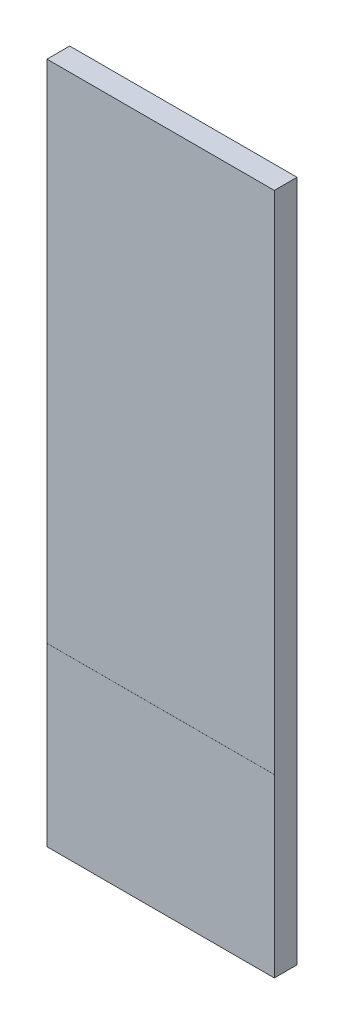
ISO-10303-21;
HEADER;
FILE_DESCRIPTION(('STEP AP214'),'2;1');
FILE_NAME('part.step','',(''),(''),'','','');
FILE_SCHEMA(('AUTOMOTIVE_DESIGN { 1 0 10303 214 1 1 1 1 }'));
ENDSEC;
DATA;
#1=APPLICATION_CONTEXT('core data for automotive mechanical design processes');
#2=APPLICATION_PROTOCOL_DEFINITION('international standard','automotive_design',2000,#1);
#3=PRODUCT_CONTEXT('',#1,'mechanical');
#4=PRODUCT('Part','Part','',(#3));
#5=PRODUCT_RELATED_PRODUCT_CATEGORY('part','',(#4));
#6=PRODUCT_DEFINITION_FORMATION('','',#4);
#7=PRODUCT_DEFINITION_CONTEXT('part definition',#1,'design');
#8=PRODUCT_DEFINITION('design','',#6,#7);
#9=PRODUCT_DEFINITION_SHAPE('','',#8);
#10=(LENGTH_UNIT() NAMED_UNIT(*) SI_UNIT(.MILLI.,.METRE.));
#11=(NAMED_UNIT(*) PLANE_ANGLE_UNIT() SI_UNIT($,.RADIAN.));
#12=(NAMED_UNIT(*) SI_UNIT($,.STERADIAN.) SOLID_ANGLE_UNIT());
#13=UNCERTAINTY_MEASURE_WITH_UNIT(LENGTH_MEASURE(1.E-05),#10,'distance_accuracy_value','');
#14=(GEOMETRIC_REPRESENTATION_CONTEXT(3) GLOBAL_UNCERTAINTY_ASSIGNED_CONTEXT((#13)) GLOBAL_UNIT_ASSIGNED_CONTEXT((#10,
#11,#12)) REPRESENTATION_CONTEXT('',''));
#15=CARTESIAN_POINT('',(0.,0.,0.));
#16=DIRECTION('',(0.,0.,1.));
#17=DIRECTION('',(1.,0.,0.));
#18=AXIS2_PLACEMENT_3D('',#15,#16,#17);
#19=CARTESIAN_POINT('',(0.,0.,4.));
#20=DIRECTION('',(0.,0.,1.));
#21=DIRECTION('',(1.,0.,0.));
#22=AXIS2_PLACEMENT_3D('',#19,#20,#21);
#23=PLANE('',#22);
#24=DIRECTION('',(-1.,0.,0.));
#25=VECTOR('',#24,1.);
#26=CARTESIAN_POINT('',(-20.,-29.,4.));
#27=LINE('',#26,#25);
#28=CARTESIAN_POINT('',(20.,-29.,4.));
#29=VERTEX_POINT('',#28);
#30=CARTESIAN_POINT('',(-20.,-29.,4.));
#31=VERTEX_POINT('',#30);
#32=EDGE_CURVE('E129',#29,#31,#27,.T.);
#33=ORIENTED_EDGE('',*,*,#32,.F.);
#34=DIRECTION('',(0.,1.,0.));
#35=VECTOR('',#34,1.);
#36=CARTESIAN_POINT('',(20.,60.,4.));
#37=LINE('',#36,#35);
#38=CARTESIAN_POINT('',(20.,60.,4.));
#39=VERTEX_POINT('',#38);
#40=EDGE_CURVE('E91',#29,#39,#37,.T.);
#41=ORIENTED_EDGE('',*,*,#40,.T.);
#42=DIRECTION('',(-1.,0.,0.));
#43=VECTOR('',#42,1.);
#44=CARTESIAN_POINT('',(-20.,60.,4.));
#45=LINE('',#44,#43);
#46=CARTESIAN_POINT('',(-20.,60.,4.));
#47=VERTEX_POINT('',#46);
#48=EDGE_CURVE('E143',#39,#47,#45,.T.);
#49=ORIENTED_EDGE('',*,*,#48,.T.);
#50=DIRECTION('',(0.,-1.,0.));
#51=VECTOR('',#50,1.);
#52=CARTESIAN_POINT('',(-20.,60.,4.));
#53=LINE('',#52,#51);
#54=EDGE_CURVE('E145',#47,#31,#53,.T.);
#55=ORIENTED_EDGE('',*,*,#54,.T.);
#56=EDGE_LOOP('',(#33,#41,#49,#55));
#57=FACE_BOUND('',#56,.T.);
#58=ADVANCED_FACE('F38',(#57),#23,.T.);
#59=CARTESIAN_POINT('',(20.,60.,4.));
#60=DIRECTION('',(-1.,0.,0.));
#61=DIRECTION('',(0.,-1.,0.));
#62=AXIS2_PLACEMENT_3D('',#59,#60,#61);
#63=PLANE('',#62);
#64=ORIENTED_EDGE('',*,*,#40,.F.);
#65=DIRECTION('',(0.,0.,1.));
#66=VECTOR('',#65,1.);
#67=CARTESIAN_POINT('',(20.,-29.,3.99));
#68=LINE('',#67,#66);
#69=CARTESIAN_POINT('',(20.,-29.,3.99));
#70=VERTEX_POINT('',#69);
#71=EDGE_CURVE('E136',#70,#29,#68,.T.);
#72=ORIENTED_EDGE('',*,*,#71,.F.);
#73=DIRECTION('',(0.,1.,0.));
#74=VECTOR('',#73,1.);
#75=CARTESIAN_POINT('',(20.,-29.,3.99));
#76=LINE('',#75,#74);
#77=CARTESIAN_POINT('',(20.,-29.01,3.99));
#78=VERTEX_POINT('',#77);
#79=EDGE_CURVE('E119',#78,#70,#76,.T.);
#80=ORIENTED_EDGE('',*,*,#79,.F.);
#81=DIRECTION('',(0.,0.,1.));
#82=VECTOR('',#81,1.);
#83=CARTESIAN_POINT('',(20.,-29.01,3.99));
#84=LINE('',#83,#82);
#85=CARTESIAN_POINT('',(20.,-29.01,4.));
#86=VERTEX_POINT('',#85);
#87=EDGE_CURVE('E116',#78,#86,#84,.T.);
#88=ORIENTED_EDGE('',*,*,#87,.T.);
#89=CARTESIAN_POINT('',(20.,-60.,4.));
#90=VERTEX_POINT('',#89);
#91=EDGE_CURVE('E141',#90,#86,#37,.T.);
#92=ORIENTED_EDGE('',*,*,#91,.F.);
#93=DIRECTION('',(0.,0.,-1.));
#94=VECTOR('',#93,1.);
#95=CARTESIAN_POINT('',(20.,-60.,4.));
#96=LINE('',#95,#94);
#97=CARTESIAN_POINT('',(20.,-60.,0.));
#98=VERTEX_POINT('',#97);
#99=EDGE_CURVE('E149',#90,#98,#96,.T.);
#100=ORIENTED_EDGE('',*,*,#99,.T.);
#101=DIRECTION('',(0.,1.,0.));
#102=VECTOR('',#101,1.);
#103=CARTESIAN_POINT('',(20.,60.,0.));
#104=LINE('',#103,#102);
#105=CARTESIAN_POINT('',(20.,60.,0.));
#106=VERTEX_POINT('',#105);
#107=EDGE_CURVE('E150',#98,#106,#104,.T.);
#108=ORIENTED_EDGE('',*,*,#107,.T.);
#109=DIRECTION('',(0.,0.,-1.));
#110=VECTOR('',#109,1.);
#111=CARTESIAN_POINT('',(20.,60.,4.));
#112=LINE('',#111,#110);
#113=EDGE_CURVE('E11',#39,#106,#112,.T.);
#114=ORIENTED_EDGE('',*,*,#113,.F.);
#115=EDGE_LOOP('',(#64,#72,#80,#88,#92,#100,#108,#114));
#116=FACE_BOUND('',#115,.T.);
#117=ADVANCED_FACE('F40',(#116),#63,.F.);
#118=CARTESIAN_POINT('',(-20.,60.,4.));
#119=DIRECTION('',(0.,-1.,0.));
#120=DIRECTION('',(0.,0.,-1.));
#121=AXIS2_PLACEMENT_3D('',#118,#119,#120);
#122=PLANE('',#121);
#123=DIRECTION('',(-1.,0.,0.));
#124=VECTOR('',#123,1.);
#125=CARTESIAN_POINT('',(-20.,60.,0.));
#126=LINE('',#125,#124);
#127=CARTESIAN_POINT('',(-20.,60.,0.));
#128=VERTEX_POINT('',#127);
#129=EDGE_CURVE('E153',#106,#128,#126,.T.);
#130=ORIENTED_EDGE('',*,*,#129,.T.);
#131=DIRECTION('',(0.,0.,-1.));
#132=VECTOR('',#131,1.);
#133=CARTESIAN_POINT('',(-20.,60.,4.));
#134=LINE('',#133,#132);
#135=EDGE_CURVE('E46',#47,#128,#134,.T.);
#136=ORIENTED_EDGE('',*,*,#135,.F.);
#137=ORIENTED_EDGE('',*,*,#48,.F.);
#138=ORIENTED_EDGE('',*,*,#113,.T.);
#139=EDGE_LOOP('',(#130,#136,#137,#138));
#140=FACE_BOUND('',#139,.T.);
#141=ADVANCED_FACE('F181',(#140),#122,.F.);
#142=CARTESIAN_POINT('',(-20.,60.,4.));
#143=DIRECTION('',(1.,0.,0.));
#144=DIRECTION('',(0.,1.,0.));
#145=AXIS2_PLACEMENT_3D('',#142,#143,#144);
#146=PLANE('',#145);
#147=DIRECTION('',(0.,-1.,0.));
#148=VECTOR('',#147,1.);
#149=CARTESIAN_POINT('',(-20.,-29.,3.99));
#150=LINE('',#149,#148);
#151=CARTESIAN_POINT('',(-20.,-29.,3.99));
#152=VERTEX_POINT('',#151);
#153=CARTESIAN_POINT('',(-20.,-29.01,3.99));
#154=VERTEX_POINT('',#153);
#155=EDGE_CURVE('E120',#152,#154,#150,.T.);
#156=ORIENTED_EDGE('',*,*,#155,.F.);
#157=DIRECTION('',(0.,0.,1.));
#158=VECTOR('',#157,1.);
#159=CARTESIAN_POINT('',(-20.,-29.,3.99));
#160=LINE('',#159,#158);
#161=EDGE_CURVE('E154',#152,#31,#160,.T.);
#162=ORIENTED_EDGE('',*,*,#161,.T.);
#163=ORIENTED_EDGE('',*,*,#54,.F.);
#164=ORIENTED_EDGE('',*,*,#135,.T.);
#165=DIRECTION('',(0.,-1.,0.));
#166=VECTOR('',#165,1.);
#167=CARTESIAN_POINT('',(-20.,60.,0.));
#168=LINE('',#167,#166);
#169=CARTESIAN_POINT('',(-20.,-60.,0.));
#170=VERTEX_POINT('',#169);
#171=EDGE_CURVE('E156',#128,#170,#168,.T.);
#172=ORIENTED_EDGE('',*,*,#171,.T.);
#173=DIRECTION('',(0.,0.,-1.));
#174=VECTOR('',#173,1.);
#175=CARTESIAN_POINT('',(-20.,-60.,4.));
#176=LINE('',#175,#174);
#177=CARTESIAN_POINT('',(-20.,-60.,4.));
#178=VERTEX_POINT('',#177);
#179=EDGE_CURVE('E160',#178,#170,#176,.T.);
#180=ORIENTED_EDGE('',*,*,#179,.F.);
#181=CARTESIAN_POINT('',(-20.,-29.01,4.));
#182=VERTEX_POINT('',#181);
#183=EDGE_CURVE('E134',#182,#178,#53,.T.);
#184=ORIENTED_EDGE('',*,*,#183,.F.);
#185=DIRECTION('',(0.,0.,1.));
#186=VECTOR('',#185,1.);
#187=CARTESIAN_POINT('',(-20.,-29.01,3.99));
#188=LINE('',#187,#186);
#189=EDGE_CURVE('E53',#154,#182,#188,.T.);
#190=ORIENTED_EDGE('',*,*,#189,.F.);
#191=EDGE_LOOP('',(#156,#162,#163,#164,#172,#180,#184,#190));
#192=FACE_BOUND('',#191,.T.);
#193=ADVANCED_FACE('F132',(#192),#146,.F.);
#194=CARTESIAN_POINT('',(-20.,-60.,4.));
#195=DIRECTION('',(0.,1.,0.));
#196=DIRECTION('',(0.,0.,1.));
#197=AXIS2_PLACEMENT_3D('',#194,#195,#196);
#198=PLANE('',#197);
#199=DIRECTION('',(1.,0.,0.));
#200=VECTOR('',#199,1.);
#201=CARTESIAN_POINT('',(-20.,-60.,0.));
#202=LINE('',#201,#200);
#203=EDGE_CURVE('E83',#170,#98,#202,.T.);
#204=ORIENTED_EDGE('',*,*,#203,.T.);
#205=ORIENTED_EDGE('',*,*,#99,.F.);
#206=DIRECTION('',(1.,0.,0.));
#207=VECTOR('',#206,1.);
#208=CARTESIAN_POINT('',(-20.,-60.,4.));
#209=LINE('',#208,#207);
#210=EDGE_CURVE('E62',#178,#90,#209,.T.);
#211=ORIENTED_EDGE('',*,*,#210,.F.);
#212=ORIENTED_EDGE('',*,*,#179,.T.);
#213=EDGE_LOOP('',(#204,#205,#211,#212));
#214=FACE_BOUND('',#213,.T.);
#215=ADVANCED_FACE('F172',(#214),#198,.F.);
#216=DIRECTION('',(1.,0.,0.));
#217=VECTOR('',#216,1.);
#218=CARTESIAN_POINT('',(-20.,-29.01,4.));
#219=LINE('',#218,#217);
#220=EDGE_CURVE('E252',#182,#86,#219,.T.);
#221=ORIENTED_EDGE('',*,*,#220,.F.);
#222=ORIENTED_EDGE('',*,*,#183,.T.);
#223=ORIENTED_EDGE('',*,*,#210,.T.);
#224=ORIENTED_EDGE('',*,*,#91,.T.);
#225=EDGE_LOOP('',(#221,#222,#223,#224));
#226=FACE_BOUND('',#225,.T.);
#227=ADVANCED_FACE('F174',(#226),#23,.T.);
#228=CARTESIAN_POINT('',(0.,0.,0.));
#229=DIRECTION('',(0.,0.,1.));
#230=DIRECTION('',(1.,0.,0.));
#231=AXIS2_PLACEMENT_3D('',#228,#229,#230);
#232=PLANE('',#231);
#233=ORIENTED_EDGE('',*,*,#107,.F.);
#234=ORIENTED_EDGE('',*,*,#203,.F.);
#235=ORIENTED_EDGE('',*,*,#171,.F.);
#236=ORIENTED_EDGE('',*,*,#129,.F.);
#237=EDGE_LOOP('',(#233,#234,#235,#236));
#238=FACE_BOUND('',#237,.T.);
#239=ADVANCED_FACE('F168',(#238),#232,.F.);
#240=CARTESIAN_POINT('',(-20.,-29.,3.99));
#241=DIRECTION('',(0.,1.,0.));
#242=DIRECTION('',(0.,0.,1.));
#243=AXIS2_PLACEMENT_3D('',#240,#241,#242);
#244=PLANE('',#243);
#245=ORIENTED_EDGE('',*,*,#32,.T.);
#246=ORIENTED_EDGE('',*,*,#161,.F.);
#247=DIRECTION('',(-1.,0.,0.));
#248=VECTOR('',#247,1.);
#249=CARTESIAN_POINT('',(-20.,-29.,3.99));
#250=LINE('',#249,#248);
#251=EDGE_CURVE('E126',#70,#152,#250,.T.);
#252=ORIENTED_EDGE('',*,*,#251,.F.);
#253=ORIENTED_EDGE('',*,*,#71,.T.);
#254=EDGE_LOOP('',(#245,#246,#252,#253));
#255=FACE_BOUND('',#254,.T.);
#256=ADVANCED_FACE('F191',(#255),#244,.F.);
#257=CARTESIAN_POINT('',(-20.,-29.01,3.99));
#258=DIRECTION('',(0.,-1.,0.));
#259=DIRECTION('',(0.,0.,-1.));
#260=AXIS2_PLACEMENT_3D('',#257,#258,#259);
#261=PLANE('',#260);
#262=ORIENTED_EDGE('',*,*,#220,.T.);
#263=ORIENTED_EDGE('',*,*,#87,.F.);
#264=DIRECTION('',(1.,0.,0.));
#265=VECTOR('',#264,1.);
#266=CARTESIAN_POINT('',(-20.,-29.01,3.99));
#267=LINE('',#266,#265);
#268=EDGE_CURVE('E112',#154,#78,#267,.T.);
#269=ORIENTED_EDGE('',*,*,#268,.F.);
#270=ORIENTED_EDGE('',*,*,#189,.T.);
#271=EDGE_LOOP('',(#262,#263,#269,#270));
#272=FACE_BOUND('',#271,.T.);
#273=ADVANCED_FACE('F114',(#272),#261,.F.);
#274=CARTESIAN_POINT('',(0.,0.,3.99));
#275=DIRECTION('',(0.,0.,1.));
#276=DIRECTION('',(1.,0.,0.));
#277=AXIS2_PLACEMENT_3D('',#274,#275,#276);
#278=PLANE('',#277);
#279=ORIENTED_EDGE('',*,*,#155,.T.);
#280=ORIENTED_EDGE('',*,*,#268,.T.);
#281=ORIENTED_EDGE('',*,*,#79,.T.);
#282=ORIENTED_EDGE('',*,*,#251,.T.);
#283=EDGE_LOOP('',(#279,#280,#281,#282));
#284=FACE_BOUND('',#283,.T.);
#285=ADVANCED_FACE('F124',(#284),#278,.T.);
#286=CLOSED_SHELL('',(#58,#117,#141,#193,#215,#227,#239,#256,#273,#285));
#287=MANIFOLD_SOLID_BREP('B2',#286);
#288=ADVANCED_BREP_SHAPE_REPRESENTATION('',(#18,#287),#14);
#289=SHAPE_DEFINITION_REPRESENTATION(#9,#288);
ENDSEC;
END-ISO-10303-21;
